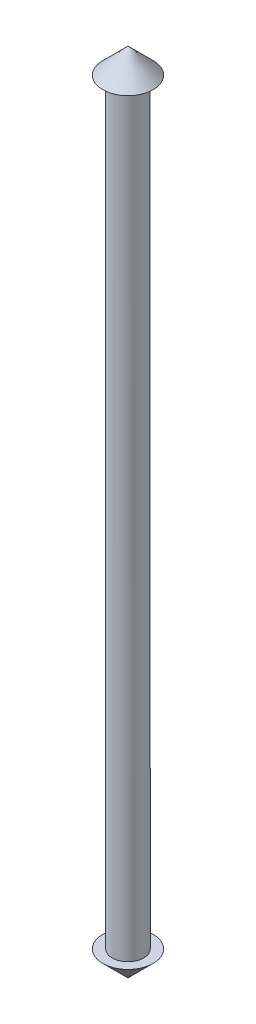
ISO-10303-21;
HEADER;
FILE_DESCRIPTION(('STEP AP214'),'2;1');
FILE_NAME('part.step','',(''),(''),'','','');
FILE_SCHEMA(('AUTOMOTIVE_DESIGN { 1 0 10303 214 1 1 1 1 }'));
ENDSEC;
DATA;
#1=APPLICATION_CONTEXT('core data for automotive mechanical design processes');
#2=APPLICATION_PROTOCOL_DEFINITION('international standard','automotive_design',2000,#1);
#3=PRODUCT_CONTEXT('',#1,'mechanical');
#4=PRODUCT('Part','Part','',(#3));
#5=PRODUCT_RELATED_PRODUCT_CATEGORY('part','',(#4));
#6=PRODUCT_DEFINITION_FORMATION('','',#4);
#7=PRODUCT_DEFINITION_CONTEXT('part definition',#1,'design');
#8=PRODUCT_DEFINITION('design','',#6,#7);
#9=PRODUCT_DEFINITION_SHAPE('','',#8);
#10=(LENGTH_UNIT() NAMED_UNIT(*) SI_UNIT(.MILLI.,.METRE.));
#11=(NAMED_UNIT(*) PLANE_ANGLE_UNIT() SI_UNIT($,.RADIAN.));
#12=(NAMED_UNIT(*) SI_UNIT($,.STERADIAN.) SOLID_ANGLE_UNIT());
#13=UNCERTAINTY_MEASURE_WITH_UNIT(LENGTH_MEASURE(1.E-05),#10,'distance_accuracy_value','');
#14=(GEOMETRIC_REPRESENTATION_CONTEXT(3) GLOBAL_UNCERTAINTY_ASSIGNED_CONTEXT((#13)) GLOBAL_UNIT_ASSIGNED_CONTEXT((#10,
#11,#12)) REPRESENTATION_CONTEXT('',''));
#15=CARTESIAN_POINT('',(0.,0.,0.));
#16=DIRECTION('',(0.,0.,1.));
#17=DIRECTION('',(1.,0.,0.));
#18=AXIS2_PLACEMENT_3D('',#15,#16,#17);
#19=CARTESIAN_POINT('',(0.,60.,0.));
#20=DIRECTION('',(0.,-1.,0.));
#21=DIRECTION('',(0.,0.,-1.));
#22=AXIS2_PLACEMENT_3D('',#19,#20,#21);
#23=CYLINDRICAL_SURFACE('',#22,2.5);
#24=CARTESIAN_POINT('',(0.,60.,0.));
#25=DIRECTION('',(0.,1.,0.));
#26=DIRECTION('',(0.,0.,1.));
#27=AXIS2_PLACEMENT_3D('',#24,#25,#26);
#28=CIRCLE('',#27,2.5);
#29=CARTESIAN_POINT('',(0.,60.,2.5));
#30=VERTEX_POINT('',#29);
#31=EDGE_CURVE('E11',#30,#30,#28,.T.);
#32=ORIENTED_EDGE('',*,*,#31,.F.);
#33=EDGE_LOOP('',(#32));
#34=FACE_BOUND('',#33,.T.);
#35=CARTESIAN_POINT('',(0.,-60.,0.));
#36=DIRECTION('',(0.,-1.,0.));
#37=DIRECTION('',(0.,0.,-1.));
#38=AXIS2_PLACEMENT_3D('',#35,#36,#37);
#39=CIRCLE('',#38,2.5);
#40=CARTESIAN_POINT('',(0.,-60.,-2.5));
#41=VERTEX_POINT('',#40);
#42=EDGE_CURVE('E58',#41,#41,#39,.T.);
#43=ORIENTED_EDGE('',*,*,#42,.F.);
#44=EDGE_LOOP('',(#43));
#45=FACE_BOUND('',#44,.T.);
#46=ADVANCED_FACE('F35',(#34,#45),#23,.T.);
#47=CARTESIAN_POINT('',(0.,60.,0.));
#48=DIRECTION('',(0.,-1.,0.));
#49=DIRECTION('',(0.,0.,1.));
#50=AXIS2_PLACEMENT_3D('',#47,#48,#49);
#51=CONICAL_SURFACE('',#50,4.,0.78539816339745);
#52=CARTESIAN_POINT('',(0.,64.,0.));
#53=VERTEX_POINT('',#52);
#54=VERTEX_LOOP('',#53);
#55=FACE_BOUND('',#54,.T.);
#56=CARTESIAN_POINT('',(0.,60.,0.));
#57=DIRECTION('',(0.,1.,0.));
#58=DIRECTION('',(0.,0.,1.));
#59=AXIS2_PLACEMENT_3D('',#56,#57,#58);
#60=CIRCLE('',#59,4.);
#61=CARTESIAN_POINT('',(0.,60.,4.));
#62=VERTEX_POINT('',#61);
#63=EDGE_CURVE('E42',#62,#62,#60,.T.);
#64=ORIENTED_EDGE('',*,*,#63,.T.);
#65=EDGE_LOOP('',(#64));
#66=FACE_BOUND('',#65,.T.);
#67=ADVANCED_FACE('F65',(#55,#66),#51,.T.);
#68=CARTESIAN_POINT('',(0.,60.,0.));
#69=DIRECTION('',(0.,1.,0.));
#70=DIRECTION('',(0.,0.,1.));
#71=AXIS2_PLACEMENT_3D('',#68,#69,#70);
#72=PLANE('',#71);
#73=ORIENTED_EDGE('',*,*,#31,.T.);
#74=EDGE_LOOP('',(#73));
#75=FACE_BOUND('',#74,.T.);
#76=ORIENTED_EDGE('',*,*,#63,.F.);
#77=EDGE_LOOP('',(#76));
#78=FACE_BOUND('',#77,.T.);
#79=ADVANCED_FACE('F52',(#75,#78),#72,.F.);
#80=CARTESIAN_POINT('',(0.,-60.,0.));
#81=DIRECTION('',(0.,1.,0.));
#82=DIRECTION('',(0.,0.,1.));
#83=AXIS2_PLACEMENT_3D('',#80,#81,#82);
#84=CONICAL_SURFACE('',#83,4.,0.78539816339745);
#85=CARTESIAN_POINT('',(0.,-64.,0.));
#86=VERTEX_POINT('',#85);
#87=VERTEX_LOOP('',#86);
#88=FACE_BOUND('',#87,.T.);
#89=CARTESIAN_POINT('',(0.,-60.,0.));
#90=DIRECTION('',(0.,1.,0.));
#91=DIRECTION('',(0.,0.,1.));
#92=AXIS2_PLACEMENT_3D('',#89,#90,#91);
#93=CIRCLE('',#92,4.);
#94=CARTESIAN_POINT('',(0.,-60.,4.));
#95=VERTEX_POINT('',#94);
#96=EDGE_CURVE('E56',#95,#95,#93,.T.);
#97=ORIENTED_EDGE('',*,*,#96,.F.);
#98=EDGE_LOOP('',(#97));
#99=FACE_BOUND('',#98,.T.);
#100=ADVANCED_FACE('F48',(#88,#99),#84,.T.);
#101=CARTESIAN_POINT('',(0.,-60.,0.));
#102=DIRECTION('',(0.,-1.,0.));
#103=DIRECTION('',(0.,0.,1.));
#104=AXIS2_PLACEMENT_3D('',#101,#102,#103);
#105=PLANE('',#104);
#106=ORIENTED_EDGE('',*,*,#42,.T.);
#107=EDGE_LOOP('',(#106));
#108=FACE_BOUND('',#107,.T.);
#109=ORIENTED_EDGE('',*,*,#96,.T.);
#110=EDGE_LOOP('',(#109));
#111=FACE_BOUND('',#110,.T.);
#112=ADVANCED_FACE('F51',(#108,#111),#105,.F.);
#113=CLOSED_SHELL('',(#46,#67,#79,#100,#112));
#114=MANIFOLD_SOLID_BREP('B2',#113);
#115=ADVANCED_BREP_SHAPE_REPRESENTATION('',(#18,#114),#14);
#116=SHAPE_DEFINITION_REPRESENTATION(#9,#115);
ENDSEC;
END-ISO-10303-21;
